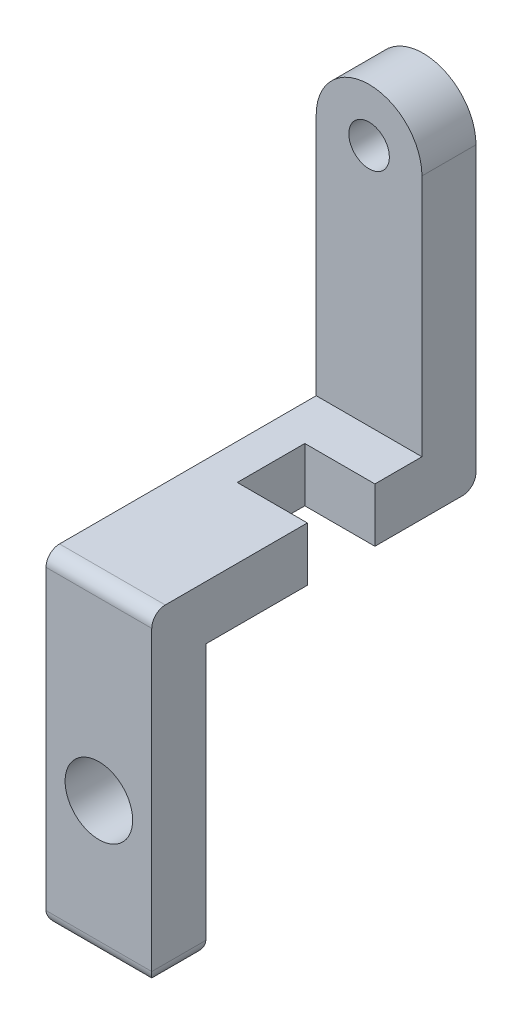
ISO-10303-21;
HEADER;
FILE_DESCRIPTION(('STEP AP214'),'2;1');
FILE_NAME('part.step','',(''),(''),'','','');
FILE_SCHEMA(('AUTOMOTIVE_DESIGN { 1 0 10303 214 1 1 1 1 }'));
ENDSEC;
DATA;
#1=APPLICATION_CONTEXT('core data for automotive mechanical design processes');
#2=APPLICATION_PROTOCOL_DEFINITION('international standard','automotive_design',2000,#1);
#3=PRODUCT_CONTEXT('',#1,'mechanical');
#4=PRODUCT('Part','Part','',(#3));
#5=PRODUCT_RELATED_PRODUCT_CATEGORY('part','',(#4));
#6=PRODUCT_DEFINITION_FORMATION('','',#4);
#7=PRODUCT_DEFINITION_CONTEXT('part definition',#1,'design');
#8=PRODUCT_DEFINITION('design','',#6,#7);
#9=PRODUCT_DEFINITION_SHAPE('','',#8);
#10=(LENGTH_UNIT() NAMED_UNIT(*) SI_UNIT(.MILLI.,.METRE.));
#11=(NAMED_UNIT(*) PLANE_ANGLE_UNIT() SI_UNIT($,.RADIAN.));
#12=(NAMED_UNIT(*) SI_UNIT($,.STERADIAN.) SOLID_ANGLE_UNIT());
#13=UNCERTAINTY_MEASURE_WITH_UNIT(LENGTH_MEASURE(1.E-05),#10,'distance_accuracy_value','');
#14=(GEOMETRIC_REPRESENTATION_CONTEXT(3) GLOBAL_UNCERTAINTY_ASSIGNED_CONTEXT((#13)) GLOBAL_UNIT_ASSIGNED_CONTEXT((#10,
#11,#12)) REPRESENTATION_CONTEXT('',''));
#15=CARTESIAN_POINT('',(0.,0.,0.));
#16=DIRECTION('',(0.,0.,1.));
#17=DIRECTION('',(1.,0.,0.));
#18=AXIS2_PLACEMENT_3D('',#15,#16,#17);
#19=CARTESIAN_POINT('',(108.41311881898,104.5,4.));
#20=DIRECTION('',(-1.,0.,0.));
#21=DIRECTION('',(0.,0.,1.));
#22=AXIS2_PLACEMENT_3D('',#19,#20,#21);
#23=PLANE('',#22);
#24=DIRECTION('',(0.,1.,0.));
#25=VECTOR('',#24,1.);
#26=CARTESIAN_POINT('',(108.41311881898,86.5,24.));
#27=LINE('',#26,#25);
#28=CARTESIAN_POINT('',(108.41311881898,63.5,24.));
#29=VERTEX_POINT('',#28);
#30=CARTESIAN_POINT('',(108.41311881898,85.5,24.));
#31=VERTEX_POINT('',#30);
#32=EDGE_CURVE('E256',#29,#31,#27,.T.);
#33=ORIENTED_EDGE('',*,*,#32,.F.);
#34=DIRECTION('',(0.,0.,-1.));
#35=VECTOR('',#34,1.);
#36=CARTESIAN_POINT('',(108.41311881898,63.5,4.));
#37=LINE('',#36,#35);
#38=CARTESIAN_POINT('',(108.41311881898,63.5,20.));
#39=VERTEX_POINT('',#38);
#40=EDGE_CURVE('E207',#29,#39,#37,.T.);
#41=ORIENTED_EDGE('',*,*,#40,.T.);
#42=DIRECTION('',(0.,1.,0.));
#43=VECTOR('',#42,1.);
#44=CARTESIAN_POINT('',(108.41311881898,86.5,20.));
#45=LINE('',#44,#43);
#46=CARTESIAN_POINT('',(108.41311881898,82.5,20.));
#47=VERTEX_POINT('',#46);
#48=EDGE_CURVE('E257',#39,#47,#45,.T.);
#49=ORIENTED_EDGE('',*,*,#48,.T.);
#50=DIRECTION('',(0.,0.,-1.));
#51=VECTOR('',#50,1.);
#52=CARTESIAN_POINT('',(108.41311881898,82.5,4.));
#53=LINE('',#52,#51);
#54=CARTESIAN_POINT('',(108.41311881898,82.5,12.4822236164977));
#55=VERTEX_POINT('',#54);
#56=EDGE_CURVE('E169',#47,#55,#53,.T.);
#57=ORIENTED_EDGE('',*,*,#56,.T.);
#58=DIRECTION('',(0.,1.,0.));
#59=VECTOR('',#58,1.);
#60=CARTESIAN_POINT('',(108.41311881898,82.5,12.4822236164977));
#61=LINE('',#60,#59);
#62=CARTESIAN_POINT('',(108.41311881898,86.5,12.4822236164977));
#63=VERTEX_POINT('',#62);
#64=EDGE_CURVE('E240',#55,#63,#61,.T.);
#65=ORIENTED_EDGE('',*,*,#64,.T.);
#66=DIRECTION('',(0.,0.,-1.));
#67=VECTOR('',#66,1.);
#68=CARTESIAN_POINT('',(108.41311881898,86.5,28.7891976633717));
#69=LINE('',#68,#67);
#70=CARTESIAN_POINT('',(108.41311881898,86.5,23.));
#71=VERTEX_POINT('',#70);
#72=EDGE_CURVE('E267',#71,#63,#69,.T.);
#73=ORIENTED_EDGE('',*,*,#72,.F.);
#74=CARTESIAN_POINT('',(108.41311881898,85.5,23.));
#75=DIRECTION('',(-1.,0.,0.));
#76=DIRECTION('',(0.,0.,1.));
#77=AXIS2_PLACEMENT_3D('',#74,#75,#76);
#78=CIRCLE('',#77,1.);
#79=EDGE_CURVE('E190',#71,#31,#78,.F.);
#80=ORIENTED_EDGE('',*,*,#79,.T.);
#81=EDGE_LOOP('',(#33,#41,#49,#57,#65,#73,#80));
#82=FACE_BOUND('',#81,.T.);
#83=ADVANCED_FACE('F33',(#82),#23,.F.);
#84=CARTESIAN_POINT('',(104.5,104.5,4.));
#85=DIRECTION('',(0.,0.,1.));
#86=DIRECTION('',(1.,0.,0.));
#87=AXIS2_PLACEMENT_3D('',#84,#85,#86);
#88=PLANE('',#87);
#89=DIRECTION('',(-1.,0.,0.));
#90=VECTOR('',#89,1.);
#91=CARTESIAN_POINT('',(108.41311881898,86.5,4.));
#92=LINE('',#91,#90);
#93=CARTESIAN_POINT('',(108.41311881898,86.5,4.));
#94=VERTEX_POINT('',#93);
#95=CARTESIAN_POINT('',(100.58688118102,86.5,4.));
#96=VERTEX_POINT('',#95);
#97=EDGE_CURVE('E259',#94,#96,#92,.T.);
#98=ORIENTED_EDGE('',*,*,#97,.F.);
#99=DIRECTION('',(0.,1.,0.));
#100=VECTOR('',#99,1.);
#101=CARTESIAN_POINT('',(108.41311881898,104.5,4.));
#102=LINE('',#101,#100);
#103=CARTESIAN_POINT('',(108.41311881898,104.5,4.));
#104=VERTEX_POINT('',#103);
#105=EDGE_CURVE('E175',#94,#104,#102,.T.);
#106=ORIENTED_EDGE('',*,*,#105,.T.);
#107=CARTESIAN_POINT('',(104.5,104.5,4.));
#108=DIRECTION('',(0.,0.,1.));
#109=DIRECTION('',(1.,0.,0.));
#110=AXIS2_PLACEMENT_3D('',#107,#108,#109);
#111=CIRCLE('',#110,3.91311881897995);
#112=CARTESIAN_POINT('',(100.58688118102,104.5,4.));
#113=VERTEX_POINT('',#112);
#114=EDGE_CURVE('E279',#104,#113,#111,.T.);
#115=ORIENTED_EDGE('',*,*,#114,.T.);
#116=DIRECTION('',(0.,-1.,0.));
#117=VECTOR('',#116,1.);
#118=CARTESIAN_POINT('',(100.58688118102,82.5,4.));
#119=LINE('',#118,#117);
#120=EDGE_CURVE('E282',#113,#96,#119,.T.);
#121=ORIENTED_EDGE('',*,*,#120,.T.);
#122=EDGE_LOOP('',(#98,#106,#115,#121));
#123=FACE_BOUND('',#122,.T.);
#124=CARTESIAN_POINT('',(104.5,104.5,4.));
#125=DIRECTION('',(0.,0.,1.));
#126=DIRECTION('',(1.,0.,0.));
#127=AXIS2_PLACEMENT_3D('',#124,#125,#126);
#128=CIRCLE('',#127,1.5);
#129=CARTESIAN_POINT('',(106.,104.5,4.));
#130=VERTEX_POINT('',#129);
#131=EDGE_CURVE('E273',#130,#130,#128,.T.);
#132=ORIENTED_EDGE('',*,*,#131,.F.);
#133=EDGE_LOOP('',(#132));
#134=FACE_BOUND('',#133,.T.);
#135=ADVANCED_FACE('F306',(#123,#134),#88,.T.);
#136=CARTESIAN_POINT('',(104.5,104.5,0.));
#137=DIRECTION('',(0.,0.,1.));
#138=DIRECTION('',(1.,0.,0.));
#139=AXIS2_PLACEMENT_3D('',#136,#137,#138);
#140=PLANE('',#139);
#141=DIRECTION('',(0.,1.,0.));
#142=VECTOR('',#141,1.);
#143=CARTESIAN_POINT('',(108.41311881898,104.5,0.));
#144=LINE('',#143,#142);
#145=CARTESIAN_POINT('',(108.41311881898,83.5,0.));
#146=VERTEX_POINT('',#145);
#147=CARTESIAN_POINT('',(108.41311881898,104.5,0.));
#148=VERTEX_POINT('',#147);
#149=EDGE_CURVE('E283',#146,#148,#144,.T.);
#150=ORIENTED_EDGE('',*,*,#149,.F.);
#151=DIRECTION('',(1.,0.,0.));
#152=VECTOR('',#151,1.);
#153=CARTESIAN_POINT('',(104.5,83.5,0.));
#154=LINE('',#153,#152);
#155=CARTESIAN_POINT('',(100.58688118102,83.5,0.));
#156=VERTEX_POINT('',#155);
#157=EDGE_CURVE('E11',#146,#156,#154,.F.);
#158=ORIENTED_EDGE('',*,*,#157,.T.);
#159=DIRECTION('',(0.,-1.,0.));
#160=VECTOR('',#159,1.);
#161=CARTESIAN_POINT('',(100.58688118102,82.5,0.));
#162=LINE('',#161,#160);
#163=CARTESIAN_POINT('',(100.58688118102,104.5,0.));
#164=VERTEX_POINT('',#163);
#165=EDGE_CURVE('E289',#164,#156,#162,.T.);
#166=ORIENTED_EDGE('',*,*,#165,.F.);
#167=CARTESIAN_POINT('',(104.5,104.5,0.));
#168=DIRECTION('',(0.,0.,1.));
#169=DIRECTION('',(1.,0.,0.));
#170=AXIS2_PLACEMENT_3D('',#167,#168,#169);
#171=CIRCLE('',#170,3.91311881897995);
#172=EDGE_CURVE('E276',#148,#164,#171,.T.);
#173=ORIENTED_EDGE('',*,*,#172,.F.);
#174=EDGE_LOOP('',(#150,#158,#166,#173));
#175=FACE_BOUND('',#174,.T.);
#176=CARTESIAN_POINT('',(104.5,104.5,0.));
#177=DIRECTION('',(0.,0.,1.));
#178=DIRECTION('',(1.,0.,0.));
#179=AXIS2_PLACEMENT_3D('',#176,#177,#178);
#180=CIRCLE('',#179,1.5);
#181=CARTESIAN_POINT('',(106.,104.5,0.));
#182=VERTEX_POINT('',#181);
#183=EDGE_CURVE('E272',#182,#182,#180,.T.);
#184=ORIENTED_EDGE('',*,*,#183,.T.);
#185=EDGE_LOOP('',(#184));
#186=FACE_BOUND('',#185,.T.);
#187=ADVANCED_FACE('F298',(#175,#186),#140,.F.);
#188=CARTESIAN_POINT('',(104.5,104.5,4.));
#189=DIRECTION('',(0.,0.,-1.));
#190=DIRECTION('',(-1.,0.,0.));
#191=AXIS2_PLACEMENT_3D('',#188,#189,#190);
#192=CYLINDRICAL_SURFACE('',#191,3.91311881897995);
#193=ORIENTED_EDGE('',*,*,#172,.T.);
#194=DIRECTION('',(0.,0.,-1.));
#195=VECTOR('',#194,1.);
#196=CARTESIAN_POINT('',(100.58688118102,104.5,4.));
#197=LINE('',#196,#195);
#198=EDGE_CURVE('E180',#113,#164,#197,.T.);
#199=ORIENTED_EDGE('',*,*,#198,.F.);
#200=ORIENTED_EDGE('',*,*,#114,.F.);
#201=DIRECTION('',(0.,0.,-1.));
#202=VECTOR('',#201,1.);
#203=CARTESIAN_POINT('',(108.41311881898,104.5,4.));
#204=LINE('',#203,#202);
#205=EDGE_CURVE('E170',#104,#148,#204,.T.);
#206=ORIENTED_EDGE('',*,*,#205,.T.);
#207=EDGE_LOOP('',(#193,#199,#200,#206));
#208=FACE_BOUND('',#207,.T.);
#209=ADVANCED_FACE('F296',(#208),#192,.T.);
#210=CARTESIAN_POINT('',(100.58688118102,82.5,4.));
#211=DIRECTION('',(1.,0.,0.));
#212=DIRECTION('',(0.,0.,-1.));
#213=AXIS2_PLACEMENT_3D('',#210,#211,#212);
#214=PLANE('',#213);
#215=DIRECTION('',(0.,-1.,0.));
#216=VECTOR('',#215,1.);
#217=CARTESIAN_POINT('',(100.58688118102,86.5,20.));
#218=LINE('',#217,#216);
#219=CARTESIAN_POINT('',(100.58688118102,82.5,19.9999999999999));
#220=VERTEX_POINT('',#219);
#221=CARTESIAN_POINT('',(100.58688118102,63.5,20.));
#222=VERTEX_POINT('',#221);
#223=EDGE_CURVE('E250',#220,#222,#218,.T.);
#224=ORIENTED_EDGE('',*,*,#223,.T.);
#225=DIRECTION('',(0.,0.,-1.));
#226=VECTOR('',#225,1.);
#227=CARTESIAN_POINT('',(100.58688118102,63.5,4.));
#228=LINE('',#227,#226);
#229=CARTESIAN_POINT('',(100.58688118102,63.5,24.));
#230=VERTEX_POINT('',#229);
#231=EDGE_CURVE('E204',#222,#230,#228,.F.);
#232=ORIENTED_EDGE('',*,*,#231,.T.);
#233=DIRECTION('',(0.,-1.,0.));
#234=VECTOR('',#233,1.);
#235=CARTESIAN_POINT('',(100.58688118102,86.5,24.));
#236=LINE('',#235,#234);
#237=CARTESIAN_POINT('',(100.58688118102,85.5,24.));
#238=VERTEX_POINT('',#237);
#239=EDGE_CURVE('E253',#238,#230,#236,.T.);
#240=ORIENTED_EDGE('',*,*,#239,.F.);
#241=CARTESIAN_POINT('',(100.58688118102,85.5,23.));
#242=DIRECTION('',(1.,0.,0.));
#243=DIRECTION('',(0.,0.,-1.));
#244=AXIS2_PLACEMENT_3D('',#241,#242,#243);
#245=CIRCLE('',#244,1.);
#246=CARTESIAN_POINT('',(100.58688118102,86.5,23.));
#247=VERTEX_POINT('',#246);
#248=EDGE_CURVE('E186',#238,#247,#245,.F.);
#249=ORIENTED_EDGE('',*,*,#248,.T.);
#250=DIRECTION('',(0.,0.,-1.));
#251=VECTOR('',#250,1.);
#252=CARTESIAN_POINT('',(100.58688118102,86.5,28.7891976633717));
#253=LINE('',#252,#251);
#254=EDGE_CURVE('E265',#247,#96,#253,.T.);
#255=ORIENTED_EDGE('',*,*,#254,.T.);
#256=ORIENTED_EDGE('',*,*,#120,.F.);
#257=ORIENTED_EDGE('',*,*,#198,.T.);
#258=ORIENTED_EDGE('',*,*,#165,.T.);
#259=CARTESIAN_POINT('',(100.58688118102,83.5,1.));
#260=DIRECTION('',(1.,0.,0.));
#261=DIRECTION('',(0.,0.,-1.));
#262=AXIS2_PLACEMENT_3D('',#259,#260,#261);
#263=CIRCLE('',#262,1.);
#264=CARTESIAN_POINT('',(100.58688118102,82.5,1.));
#265=VERTEX_POINT('',#264);
#266=EDGE_CURVE('E202',#156,#265,#263,.F.);
#267=ORIENTED_EDGE('',*,*,#266,.T.);
#268=DIRECTION('',(0.,0.,-1.));
#269=VECTOR('',#268,1.);
#270=CARTESIAN_POINT('',(100.58688118102,82.5,4.));
#271=LINE('',#270,#269);
#272=EDGE_CURVE('E173',#220,#265,#271,.T.);
#273=ORIENTED_EDGE('',*,*,#272,.F.);
#274=EDGE_LOOP('',(#224,#232,#240,#249,#255,#256,#257,#258,#267,#273));
#275=FACE_BOUND('',#274,.T.);
#276=ADVANCED_FACE('F302',(#275),#214,.F.);
#277=CARTESIAN_POINT('',(108.41311881898,82.5,4.));
#278=DIRECTION('',(0.,1.,0.));
#279=DIRECTION('',(0.,0.,1.));
#280=AXIS2_PLACEMENT_3D('',#277,#278,#279);
#281=PLANE('',#280);
#282=ORIENTED_EDGE('',*,*,#272,.T.);
#283=DIRECTION('',(1.,0.,0.));
#284=VECTOR('',#283,1.);
#285=CARTESIAN_POINT('',(108.41311881898,82.5,1.));
#286=LINE('',#285,#284);
#287=CARTESIAN_POINT('',(108.41311881898,82.5,1.));
#288=VERTEX_POINT('',#287);
#289=EDGE_CURVE('E168',#265,#288,#286,.T.);
#290=ORIENTED_EDGE('',*,*,#289,.T.);
#291=CARTESIAN_POINT('',(108.41311881898,82.5,7.48222361649771));
#292=VERTEX_POINT('',#291);
#293=EDGE_CURVE('E161',#292,#288,#53,.T.);
#294=ORIENTED_EDGE('',*,*,#293,.F.);
#295=DIRECTION('',(-1.,0.,0.));
#296=VECTOR('',#295,1.);
#297=CARTESIAN_POINT('',(108.41311881898,82.5,7.48222361649771));
#298=LINE('',#297,#296);
#299=CARTESIAN_POINT('',(103.224854749124,82.5,7.48222361649771));
#300=VERTEX_POINT('',#299);
#301=EDGE_CURVE('E145',#292,#300,#298,.T.);
#302=ORIENTED_EDGE('',*,*,#301,.T.);
#303=DIRECTION('',(0.,0.,1.));
#304=VECTOR('',#303,1.);
#305=CARTESIAN_POINT('',(103.224854749124,82.5,7.48222361649771));
#306=LINE('',#305,#304);
#307=CARTESIAN_POINT('',(103.224854749124,82.5,12.4822236164977));
#308=VERTEX_POINT('',#307);
#309=EDGE_CURVE('E156',#300,#308,#306,.T.);
#310=ORIENTED_EDGE('',*,*,#309,.T.);
#311=DIRECTION('',(1.,0.,0.));
#312=VECTOR('',#311,1.);
#313=CARTESIAN_POINT('',(108.41311881898,82.5,12.4822236164977));
#314=LINE('',#313,#312);
#315=EDGE_CURVE('E164',#308,#55,#314,.T.);
#316=ORIENTED_EDGE('',*,*,#315,.T.);
#317=ORIENTED_EDGE('',*,*,#56,.F.);
#318=DIRECTION('',(-1.,0.,0.));
#319=VECTOR('',#318,1.);
#320=CARTESIAN_POINT('',(108.41311881898,82.5,19.9999999999999));
#321=LINE('',#320,#319);
#322=EDGE_CURVE('E269',#47,#220,#321,.T.);
#323=ORIENTED_EDGE('',*,*,#322,.T.);
#324=EDGE_LOOP('',(#282,#290,#294,#302,#310,#316,#317,#323));
#325=FACE_BOUND('',#324,.T.);
#326=ADVANCED_FACE('F167',(#325),#281,.F.);
#327=ORIENTED_EDGE('',*,*,#293,.T.);
#328=CARTESIAN_POINT('',(108.41311881898,83.5,1.));
#329=DIRECTION('',(-1.,0.,0.));
#330=DIRECTION('',(0.,0.,1.));
#331=AXIS2_PLACEMENT_3D('',#328,#329,#330);
#332=CIRCLE('',#331,1.);
#333=EDGE_CURVE('E42',#288,#146,#332,.F.);
#334=ORIENTED_EDGE('',*,*,#333,.T.);
#335=ORIENTED_EDGE('',*,*,#149,.T.);
#336=ORIENTED_EDGE('',*,*,#205,.F.);
#337=ORIENTED_EDGE('',*,*,#105,.F.);
#338=CARTESIAN_POINT('',(108.41311881898,86.5,7.48222361649771));
#339=VERTEX_POINT('',#338);
#340=EDGE_CURVE('E163',#339,#94,#69,.T.);
#341=ORIENTED_EDGE('',*,*,#340,.F.);
#342=DIRECTION('',(0.,1.,0.));
#343=VECTOR('',#342,1.);
#344=CARTESIAN_POINT('',(108.41311881898,82.5,7.48222361649771));
#345=LINE('',#344,#343);
#346=EDGE_CURVE('E149',#292,#339,#345,.T.);
#347=ORIENTED_EDGE('',*,*,#346,.F.);
#348=EDGE_LOOP('',(#327,#334,#335,#336,#337,#341,#347));
#349=FACE_BOUND('',#348,.T.);
#350=ADVANCED_FACE('F160',(#349),#23,.F.);
#351=CARTESIAN_POINT('',(104.5,104.5,4.));
#352=DIRECTION('',(0.,0.,-1.));
#353=DIRECTION('',(-1.,0.,0.));
#354=AXIS2_PLACEMENT_3D('',#351,#352,#353);
#355=CYLINDRICAL_SURFACE('',#354,1.5);
#356=ORIENTED_EDGE('',*,*,#131,.T.);
#357=EDGE_LOOP('',(#356));
#358=FACE_BOUND('',#357,.T.);
#359=ORIENTED_EDGE('',*,*,#183,.F.);
#360=EDGE_LOOP('',(#359));
#361=FACE_BOUND('',#360,.T.);
#362=ADVANCED_FACE('F345',(#358,#361),#355,.F.);
#363=CARTESIAN_POINT('',(108.41311881898,86.5,28.7891976633717));
#364=DIRECTION('',(0.,-1.,0.));
#365=DIRECTION('',(0.,0.,-1.));
#366=AXIS2_PLACEMENT_3D('',#363,#364,#365);
#367=PLANE('',#366);
#368=ORIENTED_EDGE('',*,*,#254,.F.);
#369=DIRECTION('',(-1.,0.,0.));
#370=VECTOR('',#369,1.);
#371=CARTESIAN_POINT('',(108.41311881898,86.5,23.));
#372=LINE('',#371,#370);
#373=EDGE_CURVE('E188',#247,#71,#372,.F.);
#374=ORIENTED_EDGE('',*,*,#373,.T.);
#375=ORIENTED_EDGE('',*,*,#72,.T.);
#376=DIRECTION('',(1.,0.,0.));
#377=VECTOR('',#376,1.);
#378=CARTESIAN_POINT('',(108.41311881898,86.5,12.4822236164977));
#379=LINE('',#378,#377);
#380=CARTESIAN_POINT('',(103.224854749124,86.5,12.4822236164977));
#381=VERTEX_POINT('',#380);
#382=EDGE_CURVE('E157',#381,#63,#379,.T.);
#383=ORIENTED_EDGE('',*,*,#382,.F.);
#384=DIRECTION('',(0.,0.,1.));
#385=VECTOR('',#384,1.);
#386=CARTESIAN_POINT('',(103.224854749124,86.5,7.48222361649771));
#387=LINE('',#386,#385);
#388=CARTESIAN_POINT('',(103.224854749124,86.5,7.48222361649771));
#389=VERTEX_POINT('',#388);
#390=EDGE_CURVE('E230',#389,#381,#387,.T.);
#391=ORIENTED_EDGE('',*,*,#390,.F.);
#392=DIRECTION('',(-1.,0.,0.));
#393=VECTOR('',#392,1.);
#394=CARTESIAN_POINT('',(108.41311881898,86.5,7.48222361649771));
#395=LINE('',#394,#393);
#396=EDGE_CURVE('E225',#339,#389,#395,.T.);
#397=ORIENTED_EDGE('',*,*,#396,.F.);
#398=ORIENTED_EDGE('',*,*,#340,.T.);
#399=ORIENTED_EDGE('',*,*,#97,.T.);
#400=EDGE_LOOP('',(#368,#374,#375,#383,#391,#397,#398,#399));
#401=FACE_BOUND('',#400,.T.);
#402=ADVANCED_FACE('F309',(#401),#367,.F.);
#403=CARTESIAN_POINT('',(0.,0.,24.));
#404=DIRECTION('',(0.,0.,1.));
#405=DIRECTION('',(1.,0.,0.));
#406=AXIS2_PLACEMENT_3D('',#403,#404,#405);
#407=PLANE('',#406);
#408=ORIENTED_EDGE('',*,*,#239,.T.);
#409=DIRECTION('',(1.,0.,0.));
#410=VECTOR('',#409,1.);
#411=CARTESIAN_POINT('',(108.41311881898,63.5,24.));
#412=LINE('',#411,#410);
#413=EDGE_CURVE('E209',#230,#29,#412,.T.);
#414=ORIENTED_EDGE('',*,*,#413,.T.);
#415=ORIENTED_EDGE('',*,*,#32,.T.);
#416=DIRECTION('',(-1.,0.,0.));
#417=VECTOR('',#416,1.);
#418=CARTESIAN_POINT('',(100.58688118102,85.5,24.));
#419=LINE('',#418,#417);
#420=EDGE_CURVE('E183',#31,#238,#419,.T.);
#421=ORIENTED_EDGE('',*,*,#420,.T.);
#422=EDGE_LOOP('',(#408,#414,#415,#421));
#423=FACE_BOUND('',#422,.T.);
#424=CARTESIAN_POINT('',(104.5,72.5,24.));
#425=DIRECTION('',(0.,0.,1.));
#426=DIRECTION('',(1.,0.,0.));
#427=AXIS2_PLACEMENT_3D('',#424,#425,#426);
#428=CIRCLE('',#427,2.5);
#429=CARTESIAN_POINT('',(107.,72.5,24.));
#430=VERTEX_POINT('',#429);
#431=EDGE_CURVE('E247',#430,#430,#428,.T.);
#432=ORIENTED_EDGE('',*,*,#431,.F.);
#433=EDGE_LOOP('',(#432));
#434=FACE_BOUND('',#433,.T.);
#435=ADVANCED_FACE('F379',(#423,#434),#407,.T.);
#436=CARTESIAN_POINT('',(0.,0.,20.));
#437=DIRECTION('',(0.,0.,1.));
#438=DIRECTION('',(1.,0.,0.));
#439=AXIS2_PLACEMENT_3D('',#436,#437,#438);
#440=PLANE('',#439);
#441=ORIENTED_EDGE('',*,*,#48,.F.);
#442=DIRECTION('',(1.,0.,0.));
#443=VECTOR('',#442,1.);
#444=CARTESIAN_POINT('',(0.,63.5,20.));
#445=LINE('',#444,#443);
#446=EDGE_CURVE('E211',#39,#222,#445,.F.);
#447=ORIENTED_EDGE('',*,*,#446,.T.);
#448=ORIENTED_EDGE('',*,*,#223,.F.);
#449=ORIENTED_EDGE('',*,*,#322,.F.);
#450=EDGE_LOOP('',(#441,#447,#448,#449));
#451=FACE_BOUND('',#450,.T.);
#452=CARTESIAN_POINT('',(104.5,72.5,20.));
#453=DIRECTION('',(0.,0.,1.));
#454=DIRECTION('',(1.,0.,0.));
#455=AXIS2_PLACEMENT_3D('',#452,#453,#454);
#456=CIRCLE('',#455,2.5);
#457=CARTESIAN_POINT('',(107.,72.5,20.));
#458=VERTEX_POINT('',#457);
#459=EDGE_CURVE('E243',#458,#458,#456,.T.);
#460=ORIENTED_EDGE('',*,*,#459,.T.);
#461=EDGE_LOOP('',(#460));
#462=FACE_BOUND('',#461,.T.);
#463=ADVANCED_FACE('F325',(#451,#462),#440,.F.);
#464=CARTESIAN_POINT('',(100.58688118102,62.5,24.));
#465=DIRECTION('',(0.,1.,0.));
#466=DIRECTION('',(0.,0.,1.));
#467=AXIS2_PLACEMENT_3D('',#464,#465,#466);
#468=PLANE('',#467);
#469=DIRECTION('',(0.,0.,-1.));
#470=VECTOR('',#469,1.);
#471=CARTESIAN_POINT('',(107.41311881898,62.5,24.));
#472=LINE('',#471,#470);
#473=CARTESIAN_POINT('',(107.41311881898,62.5,21.));
#474=VERTEX_POINT('',#473);
#475=CARTESIAN_POINT('',(107.41311881898,62.5,23.));
#476=VERTEX_POINT('',#475);
#477=EDGE_CURVE('E195',#474,#476,#472,.F.);
#478=ORIENTED_EDGE('',*,*,#477,.T.);
#479=DIRECTION('',(1.,0.,0.));
#480=VECTOR('',#479,1.);
#481=CARTESIAN_POINT('',(100.58688118102,62.5,23.));
#482=LINE('',#481,#480);
#483=CARTESIAN_POINT('',(101.58688118102,62.5,23.));
#484=VERTEX_POINT('',#483);
#485=EDGE_CURVE('E200',#476,#484,#482,.F.);
#486=ORIENTED_EDGE('',*,*,#485,.T.);
#487=DIRECTION('',(0.,0.,-1.));
#488=VECTOR('',#487,1.);
#489=CARTESIAN_POINT('',(101.58688118102,62.5,24.));
#490=LINE('',#489,#488);
#491=CARTESIAN_POINT('',(101.58688118102,62.5,21.));
#492=VERTEX_POINT('',#491);
#493=EDGE_CURVE('E197',#484,#492,#490,.T.);
#494=ORIENTED_EDGE('',*,*,#493,.T.);
#495=DIRECTION('',(1.,0.,0.));
#496=VECTOR('',#495,1.);
#497=CARTESIAN_POINT('',(100.58688118102,62.5,21.));
#498=LINE('',#497,#496);
#499=EDGE_CURVE('E193',#492,#474,#498,.T.);
#500=ORIENTED_EDGE('',*,*,#499,.T.);
#501=EDGE_LOOP('',(#478,#486,#494,#500));
#502=FACE_BOUND('',#501,.T.);
#503=ADVANCED_FACE('F392',(#502),#468,.F.);
#504=CARTESIAN_POINT('',(104.5,72.5,24.));
#505=DIRECTION('',(0.,0.,-1.));
#506=DIRECTION('',(-1.,0.,0.));
#507=AXIS2_PLACEMENT_3D('',#504,#505,#506);
#508=CYLINDRICAL_SURFACE('',#507,2.5);
#509=ORIENTED_EDGE('',*,*,#431,.T.);
#510=EDGE_LOOP('',(#509));
#511=FACE_BOUND('',#510,.T.);
#512=ORIENTED_EDGE('',*,*,#459,.F.);
#513=EDGE_LOOP('',(#512));
#514=FACE_BOUND('',#513,.T.);
#515=ADVANCED_FACE('F385',(#511,#514),#508,.F.);
#516=CARTESIAN_POINT('',(108.41311881898,82.5,12.4822236164977));
#517=DIRECTION('',(0.,0.,1.));
#518=DIRECTION('',(1.,0.,0.));
#519=AXIS2_PLACEMENT_3D('',#516,#517,#518);
#520=PLANE('',#519);
#521=ORIENTED_EDGE('',*,*,#382,.T.);
#522=ORIENTED_EDGE('',*,*,#64,.F.);
#523=ORIENTED_EDGE('',*,*,#315,.F.);
#524=DIRECTION('',(0.,1.,0.));
#525=VECTOR('',#524,1.);
#526=CARTESIAN_POINT('',(103.224854749124,82.5,12.4822236164977));
#527=LINE('',#526,#525);
#528=EDGE_CURVE('E244',#308,#381,#527,.T.);
#529=ORIENTED_EDGE('',*,*,#528,.T.);
#530=EDGE_LOOP('',(#521,#522,#523,#529));
#531=FACE_BOUND('',#530,.T.);
#532=ADVANCED_FACE('F383',(#531),#520,.F.);
#533=CARTESIAN_POINT('',(103.224854749124,82.5,7.48222361649771));
#534=DIRECTION('',(-1.,0.,0.));
#535=DIRECTION('',(0.,0.,1.));
#536=AXIS2_PLACEMENT_3D('',#533,#534,#535);
#537=PLANE('',#536);
#538=ORIENTED_EDGE('',*,*,#390,.T.);
#539=ORIENTED_EDGE('',*,*,#528,.F.);
#540=ORIENTED_EDGE('',*,*,#309,.F.);
#541=DIRECTION('',(0.,1.,0.));
#542=VECTOR('',#541,1.);
#543=CARTESIAN_POINT('',(103.224854749124,82.5,7.48222361649771));
#544=LINE('',#543,#542);
#545=EDGE_CURVE('E151',#300,#389,#544,.T.);
#546=ORIENTED_EDGE('',*,*,#545,.T.);
#547=EDGE_LOOP('',(#538,#539,#540,#546));
#548=FACE_BOUND('',#547,.T.);
#549=ADVANCED_FACE('F313',(#548),#537,.F.);
#550=CARTESIAN_POINT('',(108.41311881898,82.5,7.48222361649771));
#551=DIRECTION('',(0.,0.,-1.));
#552=DIRECTION('',(-1.,0.,0.));
#553=AXIS2_PLACEMENT_3D('',#550,#551,#552);
#554=PLANE('',#553);
#555=ORIENTED_EDGE('',*,*,#396,.T.);
#556=ORIENTED_EDGE('',*,*,#545,.F.);
#557=ORIENTED_EDGE('',*,*,#301,.F.);
#558=ORIENTED_EDGE('',*,*,#346,.T.);
#559=EDGE_LOOP('',(#555,#556,#557,#558));
#560=FACE_BOUND('',#559,.T.);
#561=ADVANCED_FACE('F148',(#560),#554,.F.);
#562=CARTESIAN_POINT('',(0.,85.5,23.));
#563=DIRECTION('',(1.,0.,0.));
#564=DIRECTION('',(0.,0.,-1.));
#565=AXIS2_PLACEMENT_3D('',#562,#563,#564);
#566=CYLINDRICAL_SURFACE('',#565,1.);
#567=ORIENTED_EDGE('',*,*,#79,.F.);
#568=ORIENTED_EDGE('',*,*,#373,.F.);
#569=ORIENTED_EDGE('',*,*,#248,.F.);
#570=ORIENTED_EDGE('',*,*,#420,.F.);
#571=EDGE_LOOP('',(#567,#568,#569,#570));
#572=FACE_BOUND('',#571,.T.);
#573=ADVANCED_FACE('F359',(#572),#566,.T.);
#574=CARTESIAN_POINT('',(107.41311881898,63.5,4.));
#575=DIRECTION('',(0.,0.,-1.));
#576=DIRECTION('',(-1.,0.,0.));
#577=AXIS2_PLACEMENT_3D('',#574,#575,#576);
#578=CYLINDRICAL_SURFACE('',#577,1.);
#579=CARTESIAN_POINT('',(107.41311881898,63.5,21.));
#580=DIRECTION('',(0.707106781186547,0.,0.707106781186547));
#581=DIRECTION('',(0.707106781186547,0.,-0.707106781186547));
#582=AXIS2_PLACEMENT_3D('',#579,#580,#581);
#583=ELLIPSE('',#582,1.41421356237309,1.);
#584=EDGE_CURVE('E218',#39,#474,#583,.F.);
#585=ORIENTED_EDGE('',*,*,#584,.F.);
#586=ORIENTED_EDGE('',*,*,#40,.F.);
#587=CARTESIAN_POINT('',(107.41311881898,63.5,23.));
#588=DIRECTION('',(-0.707106781186547,0.,0.707106781186547));
#589=DIRECTION('',(-0.707106781186547,0.,-0.707106781186547));
#590=AXIS2_PLACEMENT_3D('',#587,#588,#589);
#591=ELLIPSE('',#590,1.41421356237309,1.);
#592=EDGE_CURVE('E37',#476,#29,#591,.T.);
#593=ORIENTED_EDGE('',*,*,#592,.F.);
#594=ORIENTED_EDGE('',*,*,#477,.F.);
#595=EDGE_LOOP('',(#585,#586,#593,#594));
#596=FACE_BOUND('',#595,.T.);
#597=ADVANCED_FACE('F361',(#596),#578,.T.);
#598=CARTESIAN_POINT('',(0.,63.5,23.));
#599=DIRECTION('',(-1.,0.,0.));
#600=DIRECTION('',(0.,0.,1.));
#601=AXIS2_PLACEMENT_3D('',#598,#599,#600);
#602=CYLINDRICAL_SURFACE('',#601,1.);
#603=ORIENTED_EDGE('',*,*,#592,.T.);
#604=ORIENTED_EDGE('',*,*,#413,.F.);
#605=CARTESIAN_POINT('',(101.58688118102,63.5,23.));
#606=DIRECTION('',(-0.707106781186547,0.,-0.707106781186547));
#607=DIRECTION('',(-0.707106781186547,0.,0.707106781186547));
#608=AXIS2_PLACEMENT_3D('',#605,#606,#607);
#609=ELLIPSE('',#608,1.41421356237309,1.);
#610=EDGE_CURVE('E217',#484,#230,#609,.T.);
#611=ORIENTED_EDGE('',*,*,#610,.F.);
#612=ORIENTED_EDGE('',*,*,#485,.F.);
#613=EDGE_LOOP('',(#603,#604,#611,#612));
#614=FACE_BOUND('',#613,.T.);
#615=ADVANCED_FACE('F366',(#614),#602,.T.);
#616=CARTESIAN_POINT('',(100.58688118102,63.5,21.));
#617=DIRECTION('',(1.,0.,0.));
#618=DIRECTION('',(0.,0.,-1.));
#619=AXIS2_PLACEMENT_3D('',#616,#617,#618);
#620=CYLINDRICAL_SURFACE('',#619,1.);
#621=ORIENTED_EDGE('',*,*,#584,.T.);
#622=ORIENTED_EDGE('',*,*,#499,.F.);
#623=CARTESIAN_POINT('',(101.58688118102,63.5,21.));
#624=DIRECTION('',(0.707106781186547,0.,-0.707106781186547));
#625=DIRECTION('',(0.707106781186547,0.,0.707106781186547));
#626=AXIS2_PLACEMENT_3D('',#623,#624,#625);
#627=ELLIPSE('',#626,1.41421356237309,1.);
#628=EDGE_CURVE('E215',#222,#492,#627,.F.);
#629=ORIENTED_EDGE('',*,*,#628,.F.);
#630=ORIENTED_EDGE('',*,*,#446,.F.);
#631=EDGE_LOOP('',(#621,#622,#629,#630));
#632=FACE_BOUND('',#631,.T.);
#633=ADVANCED_FACE('F333',(#632),#620,.T.);
#634=CARTESIAN_POINT('',(101.58688118102,63.5,24.));
#635=DIRECTION('',(0.,0.,-1.));
#636=DIRECTION('',(-1.,0.,0.));
#637=AXIS2_PLACEMENT_3D('',#634,#635,#636);
#638=CYLINDRICAL_SURFACE('',#637,1.);
#639=ORIENTED_EDGE('',*,*,#610,.T.);
#640=ORIENTED_EDGE('',*,*,#231,.F.);
#641=ORIENTED_EDGE('',*,*,#628,.T.);
#642=ORIENTED_EDGE('',*,*,#493,.F.);
#643=EDGE_LOOP('',(#639,#640,#641,#642));
#644=FACE_BOUND('',#643,.T.);
#645=ADVANCED_FACE('F329',(#644),#638,.T.);
#646=CARTESIAN_POINT('',(108.41311881898,83.5,1.));
#647=DIRECTION('',(1.,0.,0.));
#648=DIRECTION('',(0.,0.,-1.));
#649=AXIS2_PLACEMENT_3D('',#646,#647,#648);
#650=CYLINDRICAL_SURFACE('',#649,1.);
#651=ORIENTED_EDGE('',*,*,#266,.F.);
#652=ORIENTED_EDGE('',*,*,#157,.F.);
#653=ORIENTED_EDGE('',*,*,#333,.F.);
#654=ORIENTED_EDGE('',*,*,#289,.F.);
#655=EDGE_LOOP('',(#651,#652,#653,#654));
#656=FACE_BOUND('',#655,.T.);
#657=ADVANCED_FACE('F35',(#656),#650,.T.);
#658=CLOSED_SHELL('',(#83,#135,#187,#209,#276,#326,#350,#362,#402,#435,#463,#503,#515,#532,#549,
#561,#573,#597,#615,#633,#645,#657));
#659=MANIFOLD_SOLID_BREP('B2',#658);
#660=ADVANCED_BREP_SHAPE_REPRESENTATION('',(#18,#659),#14);
#661=SHAPE_DEFINITION_REPRESENTATION(#9,#660);
ENDSEC;
END-ISO-10303-21;
